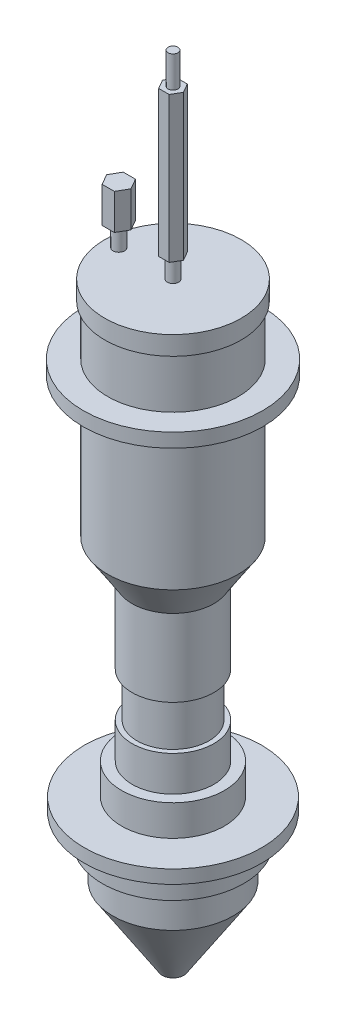
ISO-10303-21;
HEADER;
FILE_DESCRIPTION(('STEP AP214'),'2;1');
FILE_NAME('part.step','',(''),(''),'','','');
FILE_SCHEMA(('AUTOMOTIVE_DESIGN { 1 0 10303 214 1 1 1 1 }'));
ENDSEC;
DATA;
#1=APPLICATION_CONTEXT('core data for automotive mechanical design processes');
#2=APPLICATION_PROTOCOL_DEFINITION('international standard','automotive_design',2000,#1);
#3=PRODUCT_CONTEXT('',#1,'mechanical');
#4=PRODUCT('Part','Part','',(#3));
#5=PRODUCT_RELATED_PRODUCT_CATEGORY('part','',(#4));
#6=PRODUCT_DEFINITION_FORMATION('','',#4);
#7=PRODUCT_DEFINITION_CONTEXT('part definition',#1,'design');
#8=PRODUCT_DEFINITION('design','',#6,#7);
#9=PRODUCT_DEFINITION_SHAPE('','',#8);
#10=(LENGTH_UNIT() NAMED_UNIT(*) SI_UNIT(.MILLI.,.METRE.));
#11=(NAMED_UNIT(*) PLANE_ANGLE_UNIT() SI_UNIT($,.RADIAN.));
#12=(NAMED_UNIT(*) SI_UNIT($,.STERADIAN.) SOLID_ANGLE_UNIT());
#13=UNCERTAINTY_MEASURE_WITH_UNIT(LENGTH_MEASURE(1.E-05),#10,'distance_accuracy_value','');
#14=(GEOMETRIC_REPRESENTATION_CONTEXT(3) GLOBAL_UNCERTAINTY_ASSIGNED_CONTEXT((#13)) GLOBAL_UNIT_ASSIGNED_CONTEXT((#10,
#11,#12)) REPRESENTATION_CONTEXT('',''));
#15=CARTESIAN_POINT('',(0.,0.,0.));
#16=DIRECTION('',(0.,0.,1.));
#17=DIRECTION('',(1.,0.,0.));
#18=AXIS2_PLACEMENT_3D('',#15,#16,#17);
#19=CARTESIAN_POINT('',(0.,0.,0.));
#20=DIRECTION('',(0.,-1.,0.));
#21=DIRECTION('',(0.,0.,-1.));
#22=AXIS2_PLACEMENT_3D('',#19,#20,#21);
#23=PLANE('',#22);
#24=CARTESIAN_POINT('',(0.,0.,0.));
#25=DIRECTION('',(0.,-1.,0.));
#26=DIRECTION('',(0.,0.,-1.));
#27=AXIS2_PLACEMENT_3D('',#24,#25,#26);
#28=CIRCLE('',#27,7.5);
#29=CARTESIAN_POINT('',(0.,0.,7.5));
#30=VERTEX_POINT('',#29);
#31=EDGE_CURVE('E44',#30,#30,#28,.T.);
#32=ORIENTED_EDGE('',*,*,#31,.T.);
#33=EDGE_LOOP('',(#32));
#34=FACE_BOUND('',#33,.T.);
#35=ADVANCED_FACE('F41',(#34),#23,.T.);
#36=CARTESIAN_POINT('',(0.,0.,0.));
#37=DIRECTION('',(0.,1.,0.));
#38=DIRECTION('',(0.,0.,1.));
#39=AXIS2_PLACEMENT_3D('',#36,#37,#38);
#40=CONICAL_SURFACE('',#39,7.5,0.575221377485316);
#41=CARTESIAN_POINT('',(0.,53.35,0.));
#42=DIRECTION('',(0.,-1.,0.));
#43=DIRECTION('',(0.,0.,-1.));
#44=AXIS2_PLACEMENT_3D('',#41,#42,#43);
#45=CIRCLE('',#44,42.09);
#46=CARTESIAN_POINT('',(0.,53.35,42.09));
#47=VERTEX_POINT('',#46);
#48=EDGE_CURVE('E225',#47,#47,#45,.T.);
#49=CARTESIAN_POINT('',(0.,53.35,42.09));
#50=CARTESIAN_POINT('',(0.,52.7942708333333,41.7296875));
#51=CARTESIAN_POINT('',(0.,52.2385416666667,41.369375));
#52=CARTESIAN_POINT('',(0.,51.1270833333333,40.64875));
#53=CARTESIAN_POINT('',(0.,50.5713541666667,40.2884375));
#54=CARTESIAN_POINT('',(0.,49.4598958333333,39.5678125));
#55=CARTESIAN_POINT('',(0.,48.9041666666667,39.2075));
#56=CARTESIAN_POINT('',(0.,47.7927083333333,38.486875));
#57=CARTESIAN_POINT('',(0.,47.2369791666667,38.1265625));
#58=CARTESIAN_POINT('',(0.,46.1255208333333,37.4059375));
#59=CARTESIAN_POINT('',(0.,45.5697916666667,37.045625));
#60=CARTESIAN_POINT('',(0.,44.4583333333333,36.325));
#61=CARTESIAN_POINT('',(0.,43.9026041666667,35.9646875));
#62=CARTESIAN_POINT('',(0.,42.7911458333333,35.2440625));
#63=CARTESIAN_POINT('',(0.,42.2354166666667,34.88375));
#64=CARTESIAN_POINT('',(0.,41.1239583333333,34.163125));
#65=CARTESIAN_POINT('',(0.,40.5682291666667,33.8028125));
#66=CARTESIAN_POINT('',(0.,39.4567708333333,33.0821875));
#67=CARTESIAN_POINT('',(0.,38.9010416666667,32.721875));
#68=CARTESIAN_POINT('',(0.,37.7895833333333,32.00125));
#69=CARTESIAN_POINT('',(0.,37.2338541666667,31.6409375));
#70=CARTESIAN_POINT('',(0.,36.1223958333333,30.9203125));
#71=CARTESIAN_POINT('',(0.,35.5666666666667,30.56));
#72=CARTESIAN_POINT('',(0.,34.4552083333333,29.839375));
#73=CARTESIAN_POINT('',(0.,33.8994791666667,29.4790625));
#74=CARTESIAN_POINT('',(0.,32.7880208333333,28.7584375));
#75=CARTESIAN_POINT('',(0.,32.2322916666667,28.398125));
#76=CARTESIAN_POINT('',(0.,31.1208333333333,27.6775));
#77=CARTESIAN_POINT('',(0.,30.5651041666667,27.3171875));
#78=CARTESIAN_POINT('',(0.,29.4536458333333,26.5965625));
#79=CARTESIAN_POINT('',(0.,28.8979166666667,26.23625));
#80=CARTESIAN_POINT('',(0.,27.7864583333333,25.515625));
#81=CARTESIAN_POINT('',(0.,27.2307291666667,25.1553125));
#82=CARTESIAN_POINT('',(0.,26.1192708333333,24.4346875));
#83=CARTESIAN_POINT('',(0.,25.5635416666667,24.074375));
#84=CARTESIAN_POINT('',(0.,24.4520833333333,23.35375));
#85=CARTESIAN_POINT('',(0.,23.8963541666667,22.9934375));
#86=CARTESIAN_POINT('',(0.,22.7848958333333,22.2728125));
#87=CARTESIAN_POINT('',(0.,22.2291666666667,21.9125));
#88=CARTESIAN_POINT('',(0.,21.1177083333333,21.191875));
#89=CARTESIAN_POINT('',(0.,20.5619791666667,20.8315625));
#90=CARTESIAN_POINT('',(0.,19.4505208333333,20.1109375));
#91=CARTESIAN_POINT('',(0.,18.8947916666667,19.750625));
#92=CARTESIAN_POINT('',(0.,17.7833333333333,19.03));
#93=CARTESIAN_POINT('',(0.,17.2276041666667,18.6696875));
#94=CARTESIAN_POINT('',(0.,16.1161458333333,17.9490625));
#95=CARTESIAN_POINT('',(0.,15.5604166666667,17.58875));
#96=CARTESIAN_POINT('',(0.,14.4489583333333,16.868125));
#97=CARTESIAN_POINT('',(0.,13.8932291666667,16.5078125));
#98=CARTESIAN_POINT('',(0.,12.7817708333333,15.7871875));
#99=CARTESIAN_POINT('',(0.,12.2260416666667,15.426875));
#100=CARTESIAN_POINT('',(0.,11.1145833333333,14.70625));
#101=CARTESIAN_POINT('',(0.,10.5588541666667,14.3459375));
#102=CARTESIAN_POINT('',(0.,9.44739583333333,13.6253125));
#103=CARTESIAN_POINT('',(0.,8.89166666666667,13.265));
#104=CARTESIAN_POINT('',(0.,7.78020833333333,12.544375));
#105=CARTESIAN_POINT('',(0.,7.22447916666667,12.1840625));
#106=CARTESIAN_POINT('',(0.,6.11302083333333,11.4634375));
#107=CARTESIAN_POINT('',(0.,5.55729166666667,11.103125));
#108=CARTESIAN_POINT('',(0.,4.44583333333333,10.3825));
#109=CARTESIAN_POINT('',(0.,3.89010416666667,10.0221875));
#110=CARTESIAN_POINT('',(0.,2.77864583333333,9.3015625));
#111=CARTESIAN_POINT('',(0.,2.22291666666667,8.94125));
#112=CARTESIAN_POINT('',(0.,1.11145833333333,8.220625));
#113=CARTESIAN_POINT('',(0.,0.555729166666667,7.8603125));
#114=CARTESIAN_POINT('',(0.,0.,7.5));
#115=B_SPLINE_CURVE_WITH_KNOTS('',3,(#49,#50,#51,#52,#53,#54,#55,#56,#57,#58,#59,#60,#61,#62,
#63,#64,#65,#66,#67,#68,#69,#70,#71,#72,#73,#74,#75,#76,#77,#78,#79,#80,#81,#82,#83,#84,#85,#86,
#87,#88,#89,#90,#91,#92,#93,#94,#95,#96,#97,#98,#99,#100,#101,#102,#103,#104,#105,#106,#107,
#108,#109,#110,#111,#112,#113,#114),.UNSPECIFIED.,.F.,.F.,(4,2,2,2,2,2,2,2,2,2,2,2,2,2,2,2,2,2,
2,2,2,2,2,2,2,2,2,2,2,2,2,2,4),(0.,1.98694238443456,3.97388476886912,5.96082715330369,
7.94776953773825,9.93471192217281,11.9216543066074,13.9085966910419,15.8955390754765,
17.8824814599111,19.8694238443456,21.8563662287802,23.8433086132147,25.8302509976493,
27.8171933820839,29.8041357665184,31.791078150953,33.7780205353875,35.7649629198221,
37.7519053042567,39.7388476886912,41.7257900731258,43.7127324575604,45.6996748419949,
47.6866172264295,49.673559610864,51.6605019952986,53.6474443797332,55.6343867641677,
57.6213291486023,59.6082715330368,61.5952139174714,63.582156301906),.UNSPECIFIED.);
#116=EDGE_CURVE('BSEAM233',#47,#30,#115,.T.);
#117=ORIENTED_EDGE('',*,*,#48,.T.);
#118=ORIENTED_EDGE('',*,*,#31,.F.);
#119=ORIENTED_EDGE('',*,*,#116,.T.);
#120=ORIENTED_EDGE('',*,*,#116,.F.);
#121=EDGE_LOOP('',(#117,#119,#118,#120));
#122=FACE_BOUND('',#121,.T.);
#123=ADVANCED_FACE('F233',(#122),#40,.T.);
#124=CARTESIAN_POINT('',(0.,0.,0.));
#125=DIRECTION('',(0.,-1.,0.));
#126=DIRECTION('',(0.,0.,-1.));
#127=AXIS2_PLACEMENT_3D('',#124,#125,#126);
#128=CYLINDRICAL_SURFACE('',#127,42.09);
#129=CARTESIAN_POINT('',(0.,76.73,0.));
#130=DIRECTION('',(0.,-1.,0.));
#131=DIRECTION('',(0.,0.,-1.));
#132=AXIS2_PLACEMENT_3D('',#129,#130,#131);
#133=CIRCLE('',#132,42.09);
#134=CARTESIAN_POINT('',(0.,76.73,-42.09));
#135=VERTEX_POINT('',#134);
#136=EDGE_CURVE('E223',#135,#135,#133,.T.);
#137=ORIENTED_EDGE('',*,*,#136,.T.);
#138=EDGE_LOOP('',(#137));
#139=FACE_BOUND('',#138,.T.);
#140=ORIENTED_EDGE('',*,*,#48,.F.);
#141=EDGE_LOOP('',(#140));
#142=FACE_BOUND('',#141,.T.);
#143=ADVANCED_FACE('F235',(#139,#142),#128,.T.);
#144=CARTESIAN_POINT('',(42.09,76.73,0.));
#145=DIRECTION('',(0.,-1.,0.));
#146=DIRECTION('',(0.,0.,-1.));
#147=AXIS2_PLACEMENT_3D('',#144,#145,#146);
#148=PLANE('',#147);
#149=CARTESIAN_POINT('',(0.,76.73,0.));
#150=DIRECTION('',(0.,-1.,0.));
#151=DIRECTION('',(0.,0.,-1.));
#152=AXIS2_PLACEMENT_3D('',#149,#150,#151);
#153=CIRCLE('',#152,49.525);
#154=CARTESIAN_POINT('',(0.,76.73,-49.525));
#155=VERTEX_POINT('',#154);
#156=EDGE_CURVE('E220',#155,#155,#153,.T.);
#157=ORIENTED_EDGE('',*,*,#156,.T.);
#158=EDGE_LOOP('',(#157));
#159=FACE_BOUND('',#158,.T.);
#160=ORIENTED_EDGE('',*,*,#136,.F.);
#161=EDGE_LOOP('',(#160));
#162=FACE_BOUND('',#161,.T.);
#163=ADVANCED_FACE('F240',(#159,#162),#148,.T.);
#164=CARTESIAN_POINT('',(0.,0.,0.));
#165=DIRECTION('',(0.,-1.,0.));
#166=DIRECTION('',(0.,0.,-1.));
#167=AXIS2_PLACEMENT_3D('',#164,#165,#166);
#168=CYLINDRICAL_SURFACE('',#167,49.525);
#169=CARTESIAN_POINT('',(0.,95.5,0.));
#170=DIRECTION('',(0.,-1.,0.));
#171=DIRECTION('',(0.,0.,-1.));
#172=AXIS2_PLACEMENT_3D('',#169,#170,#171);
#173=CIRCLE('',#172,49.525);
#174=CARTESIAN_POINT('',(0.,95.5,-49.525));
#175=VERTEX_POINT('',#174);
#176=EDGE_CURVE('E217',#175,#175,#173,.T.);
#177=ORIENTED_EDGE('',*,*,#176,.T.);
#178=EDGE_LOOP('',(#177));
#179=FACE_BOUND('',#178,.T.);
#180=ORIENTED_EDGE('',*,*,#156,.F.);
#181=EDGE_LOOP('',(#180));
#182=FACE_BOUND('',#181,.T.);
#183=ADVANCED_FACE('F247',(#179,#182),#168,.T.);
#184=CARTESIAN_POINT('',(49.525,95.5,0.));
#185=DIRECTION('',(0.,-1.,0.));
#186=DIRECTION('',(0.,0.,-1.));
#187=AXIS2_PLACEMENT_3D('',#184,#185,#186);
#188=PLANE('',#187);
#189=CARTESIAN_POINT('',(0.,95.5,0.));
#190=DIRECTION('',(0.,-1.,0.));
#191=DIRECTION('',(0.,0.,-1.));
#192=AXIS2_PLACEMENT_3D('',#189,#190,#191);
#193=CIRCLE('',#192,62.215);
#194=CARTESIAN_POINT('',(0.,95.5,-62.215));
#195=VERTEX_POINT('',#194);
#196=EDGE_CURVE('E214',#195,#195,#193,.T.);
#197=ORIENTED_EDGE('',*,*,#196,.T.);
#198=EDGE_LOOP('',(#197));
#199=FACE_BOUND('',#198,.T.);
#200=ORIENTED_EDGE('',*,*,#176,.F.);
#201=EDGE_LOOP('',(#200));
#202=FACE_BOUND('',#201,.T.);
#203=ADVANCED_FACE('F250',(#199,#202),#188,.T.);
#204=CARTESIAN_POINT('',(0.,0.,0.));
#205=DIRECTION('',(0.,-1.,0.));
#206=DIRECTION('',(0.,0.,-1.));
#207=AXIS2_PLACEMENT_3D('',#204,#205,#206);
#208=CYLINDRICAL_SURFACE('',#207,62.215);
#209=CARTESIAN_POINT('',(0.,104.91,0.));
#210=DIRECTION('',(0.,-1.,0.));
#211=DIRECTION('',(0.,0.,-1.));
#212=AXIS2_PLACEMENT_3D('',#209,#210,#211);
#213=CIRCLE('',#212,62.215);
#214=CARTESIAN_POINT('',(0.,104.91,-62.215));
#215=VERTEX_POINT('',#214);
#216=EDGE_CURVE('E211',#215,#215,#213,.T.);
#217=ORIENTED_EDGE('',*,*,#216,.T.);
#218=EDGE_LOOP('',(#217));
#219=FACE_BOUND('',#218,.T.);
#220=ORIENTED_EDGE('',*,*,#196,.F.);
#221=EDGE_LOOP('',(#220));
#222=FACE_BOUND('',#221,.T.);
#223=ADVANCED_FACE('F254',(#219,#222),#208,.T.);
#224=CARTESIAN_POINT('',(62.215,104.91,0.));
#225=DIRECTION('',(0.,1.,0.));
#226=DIRECTION('',(0.,0.,1.));
#227=AXIS2_PLACEMENT_3D('',#224,#225,#226);
#228=PLANE('',#227);
#229=CARTESIAN_POINT('',(0.,104.91,0.));
#230=DIRECTION('',(0.,-1.,0.));
#231=DIRECTION('',(0.,0.,-1.));
#232=AXIS2_PLACEMENT_3D('',#229,#230,#231);
#233=CIRCLE('',#232,36.02);
#234=CARTESIAN_POINT('',(0.,104.91,-36.02));
#235=VERTEX_POINT('',#234);
#236=EDGE_CURVE('E208',#235,#235,#233,.T.);
#237=ORIENTED_EDGE('',*,*,#236,.T.);
#238=EDGE_LOOP('',(#237));
#239=FACE_BOUND('',#238,.T.);
#240=ORIENTED_EDGE('',*,*,#216,.F.);
#241=EDGE_LOOP('',(#240));
#242=FACE_BOUND('',#241,.T.);
#243=ADVANCED_FACE('F258',(#239,#242),#228,.T.);
#244=CARTESIAN_POINT('',(0.,0.,0.));
#245=DIRECTION('',(0.,-1.,0.));
#246=DIRECTION('',(0.,0.,-1.));
#247=AXIS2_PLACEMENT_3D('',#244,#245,#246);
#248=CYLINDRICAL_SURFACE('',#247,36.02);
#249=CARTESIAN_POINT('',(0.,126.55,0.));
#250=DIRECTION('',(0.,-1.,0.));
#251=DIRECTION('',(0.,0.,-1.));
#252=AXIS2_PLACEMENT_3D('',#249,#250,#251);
#253=CIRCLE('',#252,36.02);
#254=CARTESIAN_POINT('',(0.,126.55,-36.02));
#255=VERTEX_POINT('',#254);
#256=EDGE_CURVE('E205',#255,#255,#253,.T.);
#257=ORIENTED_EDGE('',*,*,#256,.T.);
#258=EDGE_LOOP('',(#257));
#259=FACE_BOUND('',#258,.T.);
#260=ORIENTED_EDGE('',*,*,#236,.F.);
#261=EDGE_LOOP('',(#260));
#262=FACE_BOUND('',#261,.T.);
#263=ADVANCED_FACE('F262',(#259,#262),#248,.T.);
#264=CARTESIAN_POINT('',(36.02,126.55,0.));
#265=DIRECTION('',(0.,1.,0.));
#266=DIRECTION('',(0.,0.,1.));
#267=AXIS2_PLACEMENT_3D('',#264,#265,#266);
#268=PLANE('',#267);
#269=CARTESIAN_POINT('',(0.,126.55,0.));
#270=DIRECTION('',(0.,-1.,0.));
#271=DIRECTION('',(0.,0.,-1.));
#272=AXIS2_PLACEMENT_3D('',#269,#270,#271);
#273=CIRCLE('',#272,28.645);
#274=CARTESIAN_POINT('',(0.,126.55,-28.645));
#275=VERTEX_POINT('',#274);
#276=EDGE_CURVE('E202',#275,#275,#273,.T.);
#277=ORIENTED_EDGE('',*,*,#276,.T.);
#278=EDGE_LOOP('',(#277));
#279=FACE_BOUND('',#278,.T.);
#280=ORIENTED_EDGE('',*,*,#256,.F.);
#281=EDGE_LOOP('',(#280));
#282=FACE_BOUND('',#281,.T.);
#283=ADVANCED_FACE('F266',(#279,#282),#268,.T.);
#284=CARTESIAN_POINT('',(0.,0.,0.));
#285=DIRECTION('',(0.,-1.,0.));
#286=DIRECTION('',(0.,0.,-1.));
#287=AXIS2_PLACEMENT_3D('',#284,#285,#286);
#288=CYLINDRICAL_SURFACE('',#287,28.645);
#289=CARTESIAN_POINT('',(0.,151.31,0.));
#290=DIRECTION('',(0.,-1.,0.));
#291=DIRECTION('',(0.,0.,-1.));
#292=AXIS2_PLACEMENT_3D('',#289,#290,#291);
#293=CIRCLE('',#292,28.645);
#294=CARTESIAN_POINT('',(0.,151.31,-28.645));
#295=VERTEX_POINT('',#294);
#296=EDGE_CURVE('E199',#295,#295,#293,.T.);
#297=ORIENTED_EDGE('',*,*,#296,.T.);
#298=EDGE_LOOP('',(#297));
#299=FACE_BOUND('',#298,.T.);
#300=ORIENTED_EDGE('',*,*,#276,.F.);
#301=EDGE_LOOP('',(#300));
#302=FACE_BOUND('',#301,.T.);
#303=ADVANCED_FACE('F270',(#299,#302),#288,.T.);
#304=CARTESIAN_POINT('',(28.645,151.31,0.));
#305=DIRECTION('',(0.,1.,0.));
#306=DIRECTION('',(0.,0.,1.));
#307=AXIS2_PLACEMENT_3D('',#304,#305,#306);
#308=PLANE('',#307);
#309=CARTESIAN_POINT('',(0.,151.31,0.));
#310=DIRECTION('',(0.,-1.,0.));
#311=DIRECTION('',(0.,0.,-1.));
#312=AXIS2_PLACEMENT_3D('',#309,#310,#311);
#313=CIRCLE('',#312,25.25);
#314=CARTESIAN_POINT('',(0.,151.31,-25.25));
#315=VERTEX_POINT('',#314);
#316=EDGE_CURVE('E196',#315,#315,#313,.T.);
#317=ORIENTED_EDGE('',*,*,#316,.T.);
#318=EDGE_LOOP('',(#317));
#319=FACE_BOUND('',#318,.T.);
#320=ORIENTED_EDGE('',*,*,#296,.F.);
#321=EDGE_LOOP('',(#320));
#322=FACE_BOUND('',#321,.T.);
#323=ADVANCED_FACE('F274',(#319,#322),#308,.T.);
#324=CARTESIAN_POINT('',(0.,0.,0.));
#325=DIRECTION('',(0.,-1.,0.));
#326=DIRECTION('',(0.,0.,-1.));
#327=AXIS2_PLACEMENT_3D('',#324,#325,#326);
#328=CYLINDRICAL_SURFACE('',#327,25.25);
#329=CARTESIAN_POINT('',(0.,182.28,0.));
#330=DIRECTION('',(0.,-1.,0.));
#331=DIRECTION('',(0.,0.,-1.));
#332=AXIS2_PLACEMENT_3D('',#329,#330,#331);
#333=CIRCLE('',#332,25.25);
#334=CARTESIAN_POINT('',(0.,182.28,-25.25));
#335=VERTEX_POINT('',#334);
#336=EDGE_CURVE('E193',#335,#335,#333,.T.);
#337=ORIENTED_EDGE('',*,*,#336,.T.);
#338=EDGE_LOOP('',(#337));
#339=FACE_BOUND('',#338,.T.);
#340=ORIENTED_EDGE('',*,*,#316,.F.);
#341=EDGE_LOOP('',(#340));
#342=FACE_BOUND('',#341,.T.);
#343=ADVANCED_FACE('F278',(#339,#342),#328,.T.);
#344=CARTESIAN_POINT('',(25.25,182.28,0.));
#345=DIRECTION('',(0.,-1.,0.));
#346=DIRECTION('',(0.,0.,-1.));
#347=AXIS2_PLACEMENT_3D('',#344,#345,#346);
#348=PLANE('',#347);
#349=CARTESIAN_POINT('',(0.,182.28,0.));
#350=DIRECTION('',(0.,-1.,0.));
#351=DIRECTION('',(0.,0.,-1.));
#352=AXIS2_PLACEMENT_3D('',#349,#350,#351);
#353=CIRCLE('',#352,28.645);
#354=CARTESIAN_POINT('',(0.,182.28,-28.645));
#355=VERTEX_POINT('',#354);
#356=EDGE_CURVE('E190',#355,#355,#353,.T.);
#357=ORIENTED_EDGE('',*,*,#356,.T.);
#358=EDGE_LOOP('',(#357));
#359=FACE_BOUND('',#358,.T.);
#360=ORIENTED_EDGE('',*,*,#336,.F.);
#361=EDGE_LOOP('',(#360));
#362=FACE_BOUND('',#361,.T.);
#363=ADVANCED_FACE('F282',(#359,#362),#348,.T.);
#364=CARTESIAN_POINT('',(0.,0.,0.));
#365=DIRECTION('',(0.,-1.,0.));
#366=DIRECTION('',(0.,0.,-1.));
#367=AXIS2_PLACEMENT_3D('',#364,#365,#366);
#368=CYLINDRICAL_SURFACE('',#367,28.645);
#369=CARTESIAN_POINT('',(0.,236.27,0.));
#370=DIRECTION('',(0.,-1.,0.));
#371=DIRECTION('',(0.,0.,-1.));
#372=AXIS2_PLACEMENT_3D('',#369,#370,#371);
#373=CIRCLE('',#372,28.645);
#374=CARTESIAN_POINT('',(0.,236.27,-28.645));
#375=VERTEX_POINT('',#374);
#376=EDGE_CURVE('E187',#375,#375,#373,.T.);
#377=ORIENTED_EDGE('',*,*,#376,.T.);
#378=EDGE_LOOP('',(#377));
#379=FACE_BOUND('',#378,.T.);
#380=ORIENTED_EDGE('',*,*,#356,.F.);
#381=EDGE_LOOP('',(#380));
#382=FACE_BOUND('',#381,.T.);
#383=ADVANCED_FACE('F286',(#379,#382),#368,.T.);
#384=CARTESIAN_POINT('',(0.,236.27,0.));
#385=DIRECTION('',(0.,1.,0.));
#386=DIRECTION('',(0.,0.,1.));
#387=AXIS2_PLACEMENT_3D('',#384,#385,#386);
#388=CONICAL_SURFACE('',#387,28.645,0.575309350178365);
#389=CARTESIAN_POINT('',(0.,262.67,0.));
#390=DIRECTION('',(0.,-1.,0.));
#391=DIRECTION('',(0.,0.,-1.));
#392=AXIS2_PLACEMENT_3D('',#389,#390,#391);
#393=CIRCLE('',#392,45.765);
#394=CARTESIAN_POINT('',(0.,262.67,-45.765));
#395=VERTEX_POINT('',#394);
#396=EDGE_CURVE('E184',#395,#395,#393,.T.);
#397=ORIENTED_EDGE('',*,*,#396,.T.);
#398=EDGE_LOOP('',(#397));
#399=FACE_BOUND('',#398,.T.);
#400=ORIENTED_EDGE('',*,*,#376,.F.);
#401=EDGE_LOOP('',(#400));
#402=FACE_BOUND('',#401,.T.);
#403=ADVANCED_FACE('F290',(#399,#402),#388,.T.);
#404=CARTESIAN_POINT('',(0.,0.,0.));
#405=DIRECTION('',(0.,-1.,0.));
#406=DIRECTION('',(0.,0.,-1.));
#407=AXIS2_PLACEMENT_3D('',#404,#405,#406);
#408=CYLINDRICAL_SURFACE('',#407,45.765);
#409=CARTESIAN_POINT('',(0.,360.73,0.));
#410=DIRECTION('',(0.,-1.,0.));
#411=DIRECTION('',(0.,0.,-1.));
#412=AXIS2_PLACEMENT_3D('',#409,#410,#411);
#413=CIRCLE('',#412,45.765);
#414=CARTESIAN_POINT('',(0.,360.73,-45.765));
#415=VERTEX_POINT('',#414);
#416=EDGE_CURVE('E181',#415,#415,#413,.T.);
#417=ORIENTED_EDGE('',*,*,#416,.T.);
#418=EDGE_LOOP('',(#417));
#419=FACE_BOUND('',#418,.T.);
#420=ORIENTED_EDGE('',*,*,#396,.F.);
#421=EDGE_LOOP('',(#420));
#422=FACE_BOUND('',#421,.T.);
#423=ADVANCED_FACE('F294',(#419,#422),#408,.T.);
#424=CARTESIAN_POINT('',(45.765,360.73,0.));
#425=DIRECTION('',(0.,-1.,0.));
#426=DIRECTION('',(0.,0.,-1.));
#427=AXIS2_PLACEMENT_3D('',#424,#425,#426);
#428=PLANE('',#427);
#429=CARTESIAN_POINT('',(0.,360.73,0.));
#430=DIRECTION('',(0.,-1.,0.));
#431=DIRECTION('',(0.,0.,-1.));
#432=AXIS2_PLACEMENT_3D('',#429,#430,#431);
#433=CIRCLE('',#432,62.835);
#434=CARTESIAN_POINT('',(0.,360.73,-62.835));
#435=VERTEX_POINT('',#434);
#436=EDGE_CURVE('E178',#435,#435,#433,.T.);
#437=ORIENTED_EDGE('',*,*,#436,.T.);
#438=EDGE_LOOP('',(#437));
#439=FACE_BOUND('',#438,.T.);
#440=ORIENTED_EDGE('',*,*,#416,.F.);
#441=EDGE_LOOP('',(#440));
#442=FACE_BOUND('',#441,.T.);
#443=ADVANCED_FACE('F298',(#439,#442),#428,.T.);
#444=CARTESIAN_POINT('',(0.,0.,0.));
#445=DIRECTION('',(0.,-1.,0.));
#446=DIRECTION('',(0.,0.,-1.));
#447=AXIS2_PLACEMENT_3D('',#444,#445,#446);
#448=CYLINDRICAL_SURFACE('',#447,62.835);
#449=CARTESIAN_POINT('',(0.,370.54,0.));
#450=DIRECTION('',(0.,-1.,0.));
#451=DIRECTION('',(0.,0.,-1.));
#452=AXIS2_PLACEMENT_3D('',#449,#450,#451);
#453=CIRCLE('',#452,62.835);
#454=CARTESIAN_POINT('',(0.,370.54,-62.835));
#455=VERTEX_POINT('',#454);
#456=EDGE_CURVE('E175',#455,#455,#453,.T.);
#457=ORIENTED_EDGE('',*,*,#456,.T.);
#458=EDGE_LOOP('',(#457));
#459=FACE_BOUND('',#458,.T.);
#460=ORIENTED_EDGE('',*,*,#436,.F.);
#461=EDGE_LOOP('',(#460));
#462=FACE_BOUND('',#461,.T.);
#463=ADVANCED_FACE('F302',(#459,#462),#448,.T.);
#464=CARTESIAN_POINT('',(62.835,370.54,0.));
#465=DIRECTION('',(0.,1.,0.));
#466=DIRECTION('',(0.,0.,1.));
#467=AXIS2_PLACEMENT_3D('',#464,#465,#466);
#468=PLANE('',#467);
#469=CARTESIAN_POINT('',(0.,370.54,0.));
#470=DIRECTION('',(0.,-1.,0.));
#471=DIRECTION('',(0.,0.,-1.));
#472=AXIS2_PLACEMENT_3D('',#469,#470,#471);
#473=CIRCLE('',#472,45.765);
#474=CARTESIAN_POINT('',(0.,370.54,-45.765));
#475=VERTEX_POINT('',#474);
#476=EDGE_CURVE('E172',#475,#475,#473,.T.);
#477=ORIENTED_EDGE('',*,*,#476,.T.);
#478=EDGE_LOOP('',(#477));
#479=FACE_BOUND('',#478,.T.);
#480=ORIENTED_EDGE('',*,*,#456,.F.);
#481=EDGE_LOOP('',(#480));
#482=FACE_BOUND('',#481,.T.);
#483=ADVANCED_FACE('F306',(#479,#482),#468,.T.);
#484=CARTESIAN_POINT('',(0.,0.,0.));
#485=DIRECTION('',(0.,-1.,0.));
#486=DIRECTION('',(0.,0.,-1.));
#487=AXIS2_PLACEMENT_3D('',#484,#485,#486);
#488=CYLINDRICAL_SURFACE('',#487,45.765);
#489=CARTESIAN_POINT('',(0.,405.93,0.));
#490=DIRECTION('',(0.,-1.,0.));
#491=DIRECTION('',(0.,0.,-1.));
#492=AXIS2_PLACEMENT_3D('',#489,#490,#491);
#493=CIRCLE('',#492,45.765);
#494=CARTESIAN_POINT('',(0.,405.93,-45.765));
#495=VERTEX_POINT('',#494);
#496=EDGE_CURVE('E169',#495,#495,#493,.T.);
#497=ORIENTED_EDGE('',*,*,#496,.T.);
#498=EDGE_LOOP('',(#497));
#499=FACE_BOUND('',#498,.T.);
#500=ORIENTED_EDGE('',*,*,#476,.F.);
#501=EDGE_LOOP('',(#500));
#502=FACE_BOUND('',#501,.T.);
#503=ADVANCED_FACE('F310',(#499,#502),#488,.T.);
#504=CARTESIAN_POINT('',(45.765,405.93,0.));
#505=DIRECTION('',(0.,-1.,0.));
#506=DIRECTION('',(0.,0.,-1.));
#507=AXIS2_PLACEMENT_3D('',#504,#505,#506);
#508=PLANE('',#507);
#509=CARTESIAN_POINT('',(0.,405.93,0.));
#510=DIRECTION('',(0.,-1.,0.));
#511=DIRECTION('',(0.,0.,-1.));
#512=AXIS2_PLACEMENT_3D('',#509,#510,#511);
#513=CIRCLE('',#512,47.82);
#514=CARTESIAN_POINT('',(0.,405.93,-47.82));
#515=VERTEX_POINT('',#514);
#516=EDGE_CURVE('E166',#515,#515,#513,.T.);
#517=ORIENTED_EDGE('',*,*,#516,.T.);
#518=EDGE_LOOP('',(#517));
#519=FACE_BOUND('',#518,.T.);
#520=ORIENTED_EDGE('',*,*,#496,.F.);
#521=EDGE_LOOP('',(#520));
#522=FACE_BOUND('',#521,.T.);
#523=ADVANCED_FACE('F314',(#519,#522),#508,.T.);
#524=CARTESIAN_POINT('',(0.,0.,0.));
#525=DIRECTION('',(0.,-1.,0.));
#526=DIRECTION('',(0.,0.,-1.));
#527=AXIS2_PLACEMENT_3D('',#524,#525,#526);
#528=CYLINDRICAL_SURFACE('',#527,47.82);
#529=CARTESIAN_POINT('',(0.,419.14,0.));
#530=DIRECTION('',(0.,-1.,0.));
#531=DIRECTION('',(0.,0.,-1.));
#532=AXIS2_PLACEMENT_3D('',#529,#530,#531);
#533=CIRCLE('',#532,47.82);
#534=CARTESIAN_POINT('',(0.,419.14,-47.82));
#535=VERTEX_POINT('',#534);
#536=EDGE_CURVE('E161',#535,#535,#533,.T.);
#537=ORIENTED_EDGE('',*,*,#536,.T.);
#538=EDGE_LOOP('',(#537));
#539=FACE_BOUND('',#538,.T.);
#540=ORIENTED_EDGE('',*,*,#516,.F.);
#541=EDGE_LOOP('',(#540));
#542=FACE_BOUND('',#541,.T.);
#543=ADVANCED_FACE('F318',(#539,#542),#528,.T.);
#544=CARTESIAN_POINT('',(47.82,419.14,0.));
#545=DIRECTION('',(0.,1.,0.));
#546=DIRECTION('',(0.,0.,1.));
#547=AXIS2_PLACEMENT_3D('',#544,#545,#546);
#548=PLANE('',#547);
#549=CARTESIAN_POINT('',(-38.,419.14,0.));
#550=DIRECTION('',(0.,1.,0.));
#551=DIRECTION('',(0.,0.,1.));
#552=AXIS2_PLACEMENT_3D('',#549,#550,#551);
#553=CIRCLE('',#552,4.);
#554=CARTESIAN_POINT('',(-38.,419.14,4.));
#555=VERTEX_POINT('',#554);
#556=EDGE_CURVE('E151',#555,#555,#553,.T.);
#557=ORIENTED_EDGE('',*,*,#556,.F.);
#558=EDGE_LOOP('',(#557));
#559=FACE_BOUND('',#558,.T.);
#560=CARTESIAN_POINT('',(0.,419.14,0.));
#561=DIRECTION('',(0.,1.,0.));
#562=DIRECTION('',(0.,0.,1.));
#563=AXIS2_PLACEMENT_3D('',#560,#561,#562);
#564=CIRCLE('',#563,4.);
#565=CARTESIAN_POINT('',(0.,419.14,4.));
#566=VERTEX_POINT('',#565);
#567=EDGE_CURVE('E155',#566,#566,#564,.T.);
#568=ORIENTED_EDGE('',*,*,#567,.F.);
#569=EDGE_LOOP('',(#568));
#570=FACE_BOUND('',#569,.T.);
#571=ORIENTED_EDGE('',*,*,#536,.F.);
#572=EDGE_LOOP('',(#571));
#573=FACE_BOUND('',#572,.T.);
#574=ADVANCED_FACE('F322',(#559,#570,#573),#548,.T.);
#575=CARTESIAN_POINT('',(0.,434.14,0.));
#576=DIRECTION('',(0.,-1.,0.));
#577=DIRECTION('',(0.,0.,-1.));
#578=AXIS2_PLACEMENT_3D('',#575,#576,#577);
#579=CYLINDRICAL_SURFACE('',#578,4.);
#580=CARTESIAN_POINT('',(0.,434.14,0.));
#581=DIRECTION('',(0.,1.,0.));
#582=DIRECTION('',(0.,0.,1.));
#583=AXIS2_PLACEMENT_3D('',#580,#581,#582);
#584=CIRCLE('',#583,4.);
#585=CARTESIAN_POINT('',(0.,434.14,4.));
#586=VERTEX_POINT('',#585);
#587=EDGE_CURVE('E158',#586,#586,#584,.T.);
#588=ORIENTED_EDGE('',*,*,#587,.F.);
#589=EDGE_LOOP('',(#588));
#590=FACE_BOUND('',#589,.T.);
#591=ORIENTED_EDGE('',*,*,#567,.T.);
#592=EDGE_LOOP('',(#591));
#593=FACE_BOUND('',#592,.T.);
#594=ADVANCED_FACE('F326',(#590,#593),#579,.T.);
#595=CARTESIAN_POINT('',(-38.,434.14,0.));
#596=DIRECTION('',(0.,-1.,0.));
#597=DIRECTION('',(0.,0.,-1.));
#598=AXIS2_PLACEMENT_3D('',#595,#596,#597);
#599=CYLINDRICAL_SURFACE('',#598,4.);
#600=CARTESIAN_POINT('',(-38.,434.14,0.));
#601=DIRECTION('',(0.,1.,0.));
#602=DIRECTION('',(0.,0.,1.));
#603=AXIS2_PLACEMENT_3D('',#600,#601,#602);
#604=CIRCLE('',#603,4.);
#605=CARTESIAN_POINT('',(-38.,434.14,4.));
#606=VERTEX_POINT('',#605);
#607=EDGE_CURVE('E152',#606,#606,#604,.T.);
#608=ORIENTED_EDGE('',*,*,#607,.F.);
#609=EDGE_LOOP('',(#608));
#610=FACE_BOUND('',#609,.T.);
#611=ORIENTED_EDGE('',*,*,#556,.T.);
#612=EDGE_LOOP('',(#611));
#613=FACE_BOUND('',#612,.T.);
#614=ADVANCED_FACE('F330',(#610,#613),#599,.T.);
#615=CARTESIAN_POINT('',(-3.67483446339197,536.14,6.365));
#616=DIRECTION('',(0.,0.,-1.));
#617=DIRECTION('',(-1.,0.,0.));
#618=AXIS2_PLACEMENT_3D('',#615,#616,#617);
#619=PLANE('',#618);
#620=DIRECTION('',(1.,0.,0.));
#621=VECTOR('',#620,1.);
#622=CARTESIAN_POINT('',(-3.67483446339197,434.14,6.365));
#623=LINE('',#622,#621);
#624=CARTESIAN_POINT('',(-3.67483446339197,434.14,6.365));
#625=VERTEX_POINT('',#624);
#626=CARTESIAN_POINT('',(3.67483446339197,434.14,6.365));
#627=VERTEX_POINT('',#626);
#628=EDGE_CURVE('E131',#625,#627,#623,.T.);
#629=ORIENTED_EDGE('',*,*,#628,.T.);
#630=DIRECTION('',(0.,-1.,0.));
#631=VECTOR('',#630,1.);
#632=CARTESIAN_POINT('',(3.67483446339197,536.14,6.365));
#633=LINE('',#632,#631);
#634=CARTESIAN_POINT('',(3.67483446339197,536.14,6.365));
#635=VERTEX_POINT('',#634);
#636=EDGE_CURVE('E149',#635,#627,#633,.T.);
#637=ORIENTED_EDGE('',*,*,#636,.F.);
#638=DIRECTION('',(1.,0.,0.));
#639=VECTOR('',#638,1.);
#640=CARTESIAN_POINT('',(-3.67483446339197,536.14,6.365));
#641=LINE('',#640,#639);
#642=CARTESIAN_POINT('',(-3.67483446339197,536.14,6.365));
#643=VERTEX_POINT('',#642);
#644=EDGE_CURVE('E142',#643,#635,#641,.T.);
#645=ORIENTED_EDGE('',*,*,#644,.F.);
#646=DIRECTION('',(0.,-1.,0.));
#647=VECTOR('',#646,1.);
#648=CARTESIAN_POINT('',(-3.67483446339197,536.14,6.365));
#649=LINE('',#648,#647);
#650=EDGE_CURVE('E127',#643,#625,#649,.T.);
#651=ORIENTED_EDGE('',*,*,#650,.T.);
#652=EDGE_LOOP('',(#629,#637,#645,#651));
#653=FACE_BOUND('',#652,.T.);
#654=ADVANCED_FACE('F334',(#653),#619,.F.);
#655=CARTESIAN_POINT('',(3.67483446339197,536.14,6.365));
#656=DIRECTION('',(-0.866025403784439,0.,-0.5));
#657=DIRECTION('',(-0.5,0.,0.866025403784439));
#658=AXIS2_PLACEMENT_3D('',#655,#656,#657);
#659=PLANE('',#658);
#660=DIRECTION('',(0.5,0.,-0.866025403784439));
#661=VECTOR('',#660,1.);
#662=CARTESIAN_POINT('',(3.67483446339197,434.14,6.365));
#663=LINE('',#662,#661);
#664=CARTESIAN_POINT('',(7.34966892678393,434.14,0.));
#665=VERTEX_POINT('',#664);
#666=EDGE_CURVE('E134',#627,#665,#663,.T.);
#667=ORIENTED_EDGE('',*,*,#666,.T.);
#668=DIRECTION('',(0.,-1.,0.));
#669=VECTOR('',#668,1.);
#670=CARTESIAN_POINT('',(7.34966892678393,536.14,0.));
#671=LINE('',#670,#669);
#672=CARTESIAN_POINT('',(7.34966892678393,536.14,0.));
#673=VERTEX_POINT('',#672);
#674=EDGE_CURVE('E146',#673,#665,#671,.T.);
#675=ORIENTED_EDGE('',*,*,#674,.F.);
#676=DIRECTION('',(0.5,0.,-0.866025403784439));
#677=VECTOR('',#676,1.);
#678=CARTESIAN_POINT('',(3.67483446339197,536.14,6.365));
#679=LINE('',#678,#677);
#680=EDGE_CURVE('E97',#635,#673,#679,.T.);
#681=ORIENTED_EDGE('',*,*,#680,.F.);
#682=ORIENTED_EDGE('',*,*,#636,.T.);
#683=EDGE_LOOP('',(#667,#675,#681,#682));
#684=FACE_BOUND('',#683,.T.);
#685=ADVANCED_FACE('F338',(#684),#659,.F.);
#686=CARTESIAN_POINT('',(7.34966892678393,536.14,0.));
#687=DIRECTION('',(-0.866025403784439,0.,0.5));
#688=DIRECTION('',(0.5,0.,0.866025403784438));
#689=AXIS2_PLACEMENT_3D('',#686,#687,#688);
#690=PLANE('',#689);
#691=DIRECTION('',(-0.5,0.,-0.866025403784439));
#692=VECTOR('',#691,1.);
#693=CARTESIAN_POINT('',(7.34966892678393,434.14,0.));
#694=LINE('',#693,#692);
#695=CARTESIAN_POINT('',(3.67483446339196,434.14,-6.365));
#696=VERTEX_POINT('',#695);
#697=EDGE_CURVE('E137',#665,#696,#694,.T.);
#698=ORIENTED_EDGE('',*,*,#697,.T.);
#699=DIRECTION('',(0.,-1.,0.));
#700=VECTOR('',#699,1.);
#701=CARTESIAN_POINT('',(3.67483446339196,536.14,-6.365));
#702=LINE('',#701,#700);
#703=CARTESIAN_POINT('',(3.67483446339196,536.14,-6.365));
#704=VERTEX_POINT('',#703);
#705=EDGE_CURVE('E122',#704,#696,#702,.T.);
#706=ORIENTED_EDGE('',*,*,#705,.F.);
#707=DIRECTION('',(-0.5,0.,-0.866025403784439));
#708=VECTOR('',#707,1.);
#709=CARTESIAN_POINT('',(7.34966892678393,536.14,0.));
#710=LINE('',#709,#708);
#711=EDGE_CURVE('E113',#673,#704,#710,.T.);
#712=ORIENTED_EDGE('',*,*,#711,.F.);
#713=ORIENTED_EDGE('',*,*,#674,.T.);
#714=EDGE_LOOP('',(#698,#706,#712,#713));
#715=FACE_BOUND('',#714,.T.);
#716=ADVANCED_FACE('F342',(#715),#690,.F.);
#717=CARTESIAN_POINT('',(3.67483446339196,536.14,-6.365));
#718=DIRECTION('',(0.,0.,1.));
#719=DIRECTION('',(1.,0.,0.));
#720=AXIS2_PLACEMENT_3D('',#717,#718,#719);
#721=PLANE('',#720);
#722=DIRECTION('',(-1.,0.,0.));
#723=VECTOR('',#722,1.);
#724=CARTESIAN_POINT('',(3.67483446339196,434.14,-6.365));
#725=LINE('',#724,#723);
#726=CARTESIAN_POINT('',(-3.67483446339197,434.14,-6.365));
#727=VERTEX_POINT('',#726);
#728=EDGE_CURVE('E121',#696,#727,#725,.T.);
#729=ORIENTED_EDGE('',*,*,#728,.T.);
#730=DIRECTION('',(0.,-1.,0.));
#731=VECTOR('',#730,1.);
#732=CARTESIAN_POINT('',(-3.67483446339197,536.14,-6.365));
#733=LINE('',#732,#731);
#734=CARTESIAN_POINT('',(-3.67483446339197,536.14,-6.365));
#735=VERTEX_POINT('',#734);
#736=EDGE_CURVE('E118',#735,#727,#733,.T.);
#737=ORIENTED_EDGE('',*,*,#736,.F.);
#738=DIRECTION('',(-1.,0.,0.));
#739=VECTOR('',#738,1.);
#740=CARTESIAN_POINT('',(3.67483446339196,536.14,-6.365));
#741=LINE('',#740,#739);
#742=EDGE_CURVE('E107',#704,#735,#741,.T.);
#743=ORIENTED_EDGE('',*,*,#742,.F.);
#744=ORIENTED_EDGE('',*,*,#705,.T.);
#745=EDGE_LOOP('',(#729,#737,#743,#744));
#746=FACE_BOUND('',#745,.T.);
#747=ADVANCED_FACE('F119',(#746),#721,.F.);
#748=CARTESIAN_POINT('',(-3.67483446339197,536.14,-6.365));
#749=DIRECTION('',(0.866025403784439,0.,0.5));
#750=DIRECTION('',(0.5,0.,-0.866025403784439));
#751=AXIS2_PLACEMENT_3D('',#748,#749,#750);
#752=PLANE('',#751);
#753=DIRECTION('',(-0.5,0.,0.866025403784439));
#754=VECTOR('',#753,1.);
#755=CARTESIAN_POINT('',(-3.67483446339197,434.14,-6.365));
#756=LINE('',#755,#754);
#757=CARTESIAN_POINT('',(-7.34966892678394,434.14,0.));
#758=VERTEX_POINT('',#757);
#759=EDGE_CURVE('E82',#727,#758,#756,.T.);
#760=ORIENTED_EDGE('',*,*,#759,.T.);
#761=DIRECTION('',(0.,-1.,0.));
#762=VECTOR('',#761,1.);
#763=CARTESIAN_POINT('',(-7.34966892678394,536.14,0.));
#764=LINE('',#763,#762);
#765=CARTESIAN_POINT('',(-7.34966892678394,536.14,0.));
#766=VERTEX_POINT('',#765);
#767=EDGE_CURVE('E123',#766,#758,#764,.T.);
#768=ORIENTED_EDGE('',*,*,#767,.F.);
#769=DIRECTION('',(-0.5,0.,0.866025403784439));
#770=VECTOR('',#769,1.);
#771=CARTESIAN_POINT('',(-3.67483446339197,536.14,-6.365));
#772=LINE('',#771,#770);
#773=EDGE_CURVE('E111',#735,#766,#772,.T.);
#774=ORIENTED_EDGE('',*,*,#773,.F.);
#775=ORIENTED_EDGE('',*,*,#736,.T.);
#776=EDGE_LOOP('',(#760,#768,#774,#775));
#777=FACE_BOUND('',#776,.T.);
#778=ADVANCED_FACE('F125',(#777),#752,.F.);
#779=CARTESIAN_POINT('',(-7.34966892678394,536.14,0.));
#780=DIRECTION('',(0.866025403784439,0.,-0.5));
#781=DIRECTION('',(-0.5,0.,-0.866025403784439));
#782=AXIS2_PLACEMENT_3D('',#779,#780,#781);
#783=PLANE('',#782);
#784=DIRECTION('',(0.5,0.,0.866025403784439));
#785=VECTOR('',#784,1.);
#786=CARTESIAN_POINT('',(-7.34966892678394,434.14,0.));
#787=LINE('',#786,#785);
#788=EDGE_CURVE('E88',#758,#625,#787,.T.);
#789=ORIENTED_EDGE('',*,*,#788,.T.);
#790=ORIENTED_EDGE('',*,*,#650,.F.);
#791=DIRECTION('',(0.5,0.,0.866025403784439));
#792=VECTOR('',#791,1.);
#793=CARTESIAN_POINT('',(-7.34966892678394,536.14,0.));
#794=LINE('',#793,#792);
#795=EDGE_CURVE('E58',#766,#643,#794,.T.);
#796=ORIENTED_EDGE('',*,*,#795,.F.);
#797=ORIENTED_EDGE('',*,*,#767,.T.);
#798=EDGE_LOOP('',(#789,#790,#796,#797));
#799=FACE_BOUND('',#798,.T.);
#800=ADVANCED_FACE('F350',(#799),#783,.F.);
#801=CARTESIAN_POINT('',(0.,536.14,0.));
#802=DIRECTION('',(0.,1.,0.));
#803=DIRECTION('',(0.,0.,1.));
#804=AXIS2_PLACEMENT_3D('',#801,#802,#803);
#805=PLANE('',#804);
#806=CARTESIAN_POINT('',(0.,536.14,0.));
#807=DIRECTION('',(0.,1.,0.));
#808=DIRECTION('',(0.,0.,1.));
#809=AXIS2_PLACEMENT_3D('',#806,#807,#808);
#810=CIRCLE('',#809,3.42);
#811=CARTESIAN_POINT('',(0.,536.14,3.42));
#812=VERTEX_POINT('',#811);
#813=EDGE_CURVE('E11',#812,#812,#810,.T.);
#814=ORIENTED_EDGE('',*,*,#813,.F.);
#815=EDGE_LOOP('',(#814));
#816=FACE_BOUND('',#815,.T.);
#817=ORIENTED_EDGE('',*,*,#644,.T.);
#818=ORIENTED_EDGE('',*,*,#680,.T.);
#819=ORIENTED_EDGE('',*,*,#711,.T.);
#820=ORIENTED_EDGE('',*,*,#742,.T.);
#821=ORIENTED_EDGE('',*,*,#773,.T.);
#822=ORIENTED_EDGE('',*,*,#795,.T.);
#823=EDGE_LOOP('',(#817,#818,#819,#820,#821,#822));
#824=FACE_BOUND('',#823,.T.);
#825=ADVANCED_FACE('F109',(#816,#824),#805,.T.);
#826=CARTESIAN_POINT('',(0.,434.14,0.));
#827=DIRECTION('',(0.,1.,0.));
#828=DIRECTION('',(0.,0.,1.));
#829=AXIS2_PLACEMENT_3D('',#826,#827,#828);
#830=PLANE('',#829);
#831=ORIENTED_EDGE('',*,*,#587,.T.);
#832=EDGE_LOOP('',(#831));
#833=FACE_BOUND('',#832,.T.);
#834=ORIENTED_EDGE('',*,*,#628,.F.);
#835=ORIENTED_EDGE('',*,*,#788,.F.);
#836=ORIENTED_EDGE('',*,*,#759,.F.);
#837=ORIENTED_EDGE('',*,*,#728,.F.);
#838=ORIENTED_EDGE('',*,*,#697,.F.);
#839=ORIENTED_EDGE('',*,*,#666,.F.);
#840=EDGE_LOOP('',(#834,#835,#836,#837,#838,#839));
#841=FACE_BOUND('',#840,.T.);
#842=ADVANCED_FACE('F353',(#833,#841),#830,.F.);
#843=CARTESIAN_POINT('',(0.,558.14,0.));
#844=DIRECTION('',(0.,-1.,0.));
#845=DIRECTION('',(0.,0.,-1.));
#846=AXIS2_PLACEMENT_3D('',#843,#844,#845);
#847=CYLINDRICAL_SURFACE('',#846,3.42);
#848=CARTESIAN_POINT('',(0.,558.14,0.));
#849=DIRECTION('',(0.,1.,0.));
#850=DIRECTION('',(0.,0.,1.));
#851=AXIS2_PLACEMENT_3D('',#848,#849,#850);
#852=CIRCLE('',#851,3.42);
#853=CARTESIAN_POINT('',(0.,558.14,3.42));
#854=VERTEX_POINT('',#853);
#855=EDGE_CURVE('E135',#854,#854,#852,.T.);
#856=ORIENTED_EDGE('',*,*,#855,.F.);
#857=EDGE_LOOP('',(#856));
#858=FACE_BOUND('',#857,.T.);
#859=ORIENTED_EDGE('',*,*,#813,.T.);
#860=EDGE_LOOP('',(#859));
#861=FACE_BOUND('',#860,.T.);
#862=ADVANCED_FACE('F356',(#858,#861),#847,.T.);
#863=CARTESIAN_POINT('',(0.,558.14,0.));
#864=DIRECTION('',(0.,1.,0.));
#865=DIRECTION('',(0.,0.,1.));
#866=AXIS2_PLACEMENT_3D('',#863,#864,#865);
#867=PLANE('',#866);
#868=ORIENTED_EDGE('',*,*,#855,.T.);
#869=EDGE_LOOP('',(#868));
#870=FACE_BOUND('',#869,.T.);
#871=ADVANCED_FACE('F363',(#870),#867,.T.);
#872=CARTESIAN_POINT('',(-33.7247212566508,459.14,7.40500000000001));
#873=DIRECTION('',(-0.866025403784439,0.,-0.5));
#874=DIRECTION('',(-0.5,0.,0.866025403784439));
#875=AXIS2_PLACEMENT_3D('',#872,#873,#874);
#876=PLANE('',#875);
#877=DIRECTION('',(0.5,0.,-0.866025403784439));
#878=VECTOR('',#877,1.);
#879=CARTESIAN_POINT('',(-33.7247212566508,434.14,7.40500000000001));
#880=LINE('',#879,#878);
#881=CARTESIAN_POINT('',(-33.7247212566508,434.14,7.40500000000001));
#882=VERTEX_POINT('',#881);
#883=CARTESIAN_POINT('',(-29.4494425133016,434.14,0.));
#884=VERTEX_POINT('',#883);
#885=EDGE_CURVE('E426',#882,#884,#880,.T.);
#886=ORIENTED_EDGE('',*,*,#885,.T.);
#887=DIRECTION('',(0.,-1.,0.));
#888=VECTOR('',#887,1.);
#889=CARTESIAN_POINT('',(-29.4494425133016,459.14,0.));
#890=LINE('',#889,#888);
#891=CARTESIAN_POINT('',(-29.4494425133016,459.14,0.));
#892=VERTEX_POINT('',#891);
#893=EDGE_CURVE('E423',#892,#884,#890,.T.);
#894=ORIENTED_EDGE('',*,*,#893,.F.);
#895=DIRECTION('',(0.5,0.,-0.866025403784439));
#896=VECTOR('',#895,1.);
#897=CARTESIAN_POINT('',(-33.7247212566508,459.14,7.40500000000001));
#898=LINE('',#897,#896);
#899=CARTESIAN_POINT('',(-33.7247212566508,459.14,7.40500000000001));
#900=VERTEX_POINT('',#899);
#901=EDGE_CURVE('E406',#900,#892,#898,.T.);
#902=ORIENTED_EDGE('',*,*,#901,.F.);
#903=DIRECTION('',(0.,-1.,0.));
#904=VECTOR('',#903,1.);
#905=CARTESIAN_POINT('',(-33.7247212566508,459.14,7.40500000000001));
#906=LINE('',#905,#904);
#907=EDGE_CURVE('E451',#900,#882,#906,.T.);
#908=ORIENTED_EDGE('',*,*,#907,.T.);
#909=EDGE_LOOP('',(#886,#894,#902,#908));
#910=FACE_BOUND('',#909,.T.);
#911=ADVANCED_FACE('F367',(#910),#876,.F.);
#912=CARTESIAN_POINT('',(-29.4494425133016,459.14,0.));
#913=DIRECTION('',(-0.866025403784438,0.,0.5));
#914=DIRECTION('',(0.5,0.,0.866025403784439));
#915=AXIS2_PLACEMENT_3D('',#912,#913,#914);
#916=PLANE('',#915);
#917=DIRECTION('',(-0.5,0.,-0.866025403784439));
#918=VECTOR('',#917,1.);
#919=CARTESIAN_POINT('',(-29.4494425133016,434.14,0.));
#920=LINE('',#919,#918);
#921=CARTESIAN_POINT('',(-33.7247212566508,434.14,-7.40500000000003));
#922=VERTEX_POINT('',#921);
#923=EDGE_CURVE('E464',#884,#922,#920,.T.);
#924=ORIENTED_EDGE('',*,*,#923,.T.);
#925=DIRECTION('',(0.,-1.,0.));
#926=VECTOR('',#925,1.);
#927=CARTESIAN_POINT('',(-33.7247212566508,459.14,-7.40500000000003));
#928=LINE('',#927,#926);
#929=CARTESIAN_POINT('',(-33.7247212566508,459.14,-7.40500000000003));
#930=VERTEX_POINT('',#929);
#931=EDGE_CURVE('E428',#930,#922,#928,.T.);
#932=ORIENTED_EDGE('',*,*,#931,.F.);
#933=DIRECTION('',(-0.5,0.,-0.866025403784439));
#934=VECTOR('',#933,1.);
#935=CARTESIAN_POINT('',(-29.4494425133016,459.14,0.));
#936=LINE('',#935,#934);
#937=EDGE_CURVE('E411',#892,#930,#936,.T.);
#938=ORIENTED_EDGE('',*,*,#937,.F.);
#939=ORIENTED_EDGE('',*,*,#893,.T.);
#940=EDGE_LOOP('',(#924,#932,#938,#939));
#941=FACE_BOUND('',#940,.T.);
#942=ADVANCED_FACE('F371',(#941),#916,.F.);
#943=CARTESIAN_POINT('',(-33.7247212566508,459.14,-7.40500000000003));
#944=DIRECTION('',(0.,0.,1.));
#945=DIRECTION('',(1.,0.,0.));
#946=AXIS2_PLACEMENT_3D('',#943,#944,#945);
#947=PLANE('',#946);
#948=DIRECTION('',(-1.,0.,0.));
#949=VECTOR('',#948,1.);
#950=CARTESIAN_POINT('',(-33.7247212566508,434.14,-7.40500000000003));
#951=LINE('',#950,#949);
#952=CARTESIAN_POINT('',(-42.2752787433492,434.14,-7.40500000000003));
#953=VERTEX_POINT('',#952);
#954=EDGE_CURVE('E461',#922,#953,#951,.T.);
#955=ORIENTED_EDGE('',*,*,#954,.T.);
#956=DIRECTION('',(0.,-1.,0.));
#957=VECTOR('',#956,1.);
#958=CARTESIAN_POINT('',(-42.2752787433492,459.14,-7.40500000000003));
#959=LINE('',#958,#957);
#960=CARTESIAN_POINT('',(-42.2752787433492,459.14,-7.40500000000003));
#961=VERTEX_POINT('',#960);
#962=EDGE_CURVE('E433',#961,#953,#959,.T.);
#963=ORIENTED_EDGE('',*,*,#962,.F.);
#964=DIRECTION('',(-1.,0.,0.));
#965=VECTOR('',#964,1.);
#966=CARTESIAN_POINT('',(-33.7247212566508,459.14,-7.40500000000003));
#967=LINE('',#966,#965);
#968=EDGE_CURVE('E473',#930,#961,#967,.T.);
#969=ORIENTED_EDGE('',*,*,#968,.F.);
#970=ORIENTED_EDGE('',*,*,#931,.T.);
#971=EDGE_LOOP('',(#955,#963,#969,#970));
#972=FACE_BOUND('',#971,.T.);
#973=ADVANCED_FACE('F375',(#972),#947,.F.);
#974=CARTESIAN_POINT('',(-42.2752787433492,459.14,-7.40500000000003));
#975=DIRECTION('',(0.866025403784438,0.,0.5));
#976=DIRECTION('',(0.5,0.,-0.866025403784438));
#977=AXIS2_PLACEMENT_3D('',#974,#975,#976);
#978=PLANE('',#977);
#979=DIRECTION('',(-0.5,0.,0.866025403784438));
#980=VECTOR('',#979,1.);
#981=CARTESIAN_POINT('',(-42.2752787433492,434.14,-7.40500000000003));
#982=LINE('',#981,#980);
#983=CARTESIAN_POINT('',(-46.5505574866984,434.14,0.));
#984=VERTEX_POINT('',#983);
#985=EDGE_CURVE('E458',#953,#984,#982,.T.);
#986=ORIENTED_EDGE('',*,*,#985,.T.);
#987=DIRECTION('',(0.,-1.,0.));
#988=VECTOR('',#987,1.);
#989=CARTESIAN_POINT('',(-46.5505574866984,459.14,0.));
#990=LINE('',#989,#988);
#991=CARTESIAN_POINT('',(-46.5505574866984,459.14,0.));
#992=VERTEX_POINT('',#991);
#993=EDGE_CURVE('E445',#992,#984,#990,.T.);
#994=ORIENTED_EDGE('',*,*,#993,.F.);
#995=DIRECTION('',(-0.5,0.,0.866025403784438));
#996=VECTOR('',#995,1.);
#997=CARTESIAN_POINT('',(-42.2752787433492,459.14,-7.40500000000003));
#998=LINE('',#997,#996);
#999=EDGE_CURVE('E470',#961,#992,#998,.T.);
#1000=ORIENTED_EDGE('',*,*,#999,.F.);
#1001=ORIENTED_EDGE('',*,*,#962,.T.);
#1002=EDGE_LOOP('',(#986,#994,#1000,#1001));
#1003=FACE_BOUND('',#1002,.T.);
#1004=ADVANCED_FACE('F379',(#1003),#978,.F.);
#1005=CARTESIAN_POINT('',(-46.5505574866984,459.14,0.));
#1006=DIRECTION('',(0.866025403784438,0.,-0.5));
#1007=DIRECTION('',(-0.5,0.,-0.866025403784439));
#1008=AXIS2_PLACEMENT_3D('',#1005,#1006,#1007);
#1009=PLANE('',#1008);
#1010=DIRECTION('',(0.5,0.,0.866025403784438));
#1011=VECTOR('',#1010,1.);
#1012=CARTESIAN_POINT('',(-46.5505574866984,434.14,0.));
#1013=LINE('',#1012,#1011);
#1014=CARTESIAN_POINT('',(-42.2752787433492,434.14,7.40500000000001));
#1015=VERTEX_POINT('',#1014);
#1016=EDGE_CURVE('E455',#984,#1015,#1013,.T.);
#1017=ORIENTED_EDGE('',*,*,#1016,.T.);
#1018=DIRECTION('',(0.,-1.,0.));
#1019=VECTOR('',#1018,1.);
#1020=CARTESIAN_POINT('',(-42.2752787433492,459.14,7.40500000000001));
#1021=LINE('',#1020,#1019);
#1022=CARTESIAN_POINT('',(-42.2752787433492,459.14,7.40500000000001));
#1023=VERTEX_POINT('',#1022);
#1024=EDGE_CURVE('E448',#1023,#1015,#1021,.T.);
#1025=ORIENTED_EDGE('',*,*,#1024,.F.);
#1026=DIRECTION('',(0.5,0.,0.866025403784438));
#1027=VECTOR('',#1026,1.);
#1028=CARTESIAN_POINT('',(-46.5505574866984,459.14,0.));
#1029=LINE('',#1028,#1027);
#1030=EDGE_CURVE('E468',#992,#1023,#1029,.T.);
#1031=ORIENTED_EDGE('',*,*,#1030,.F.);
#1032=ORIENTED_EDGE('',*,*,#993,.T.);
#1033=EDGE_LOOP('',(#1017,#1025,#1031,#1032));
#1034=FACE_BOUND('',#1033,.T.);
#1035=ADVANCED_FACE('F383',(#1034),#1009,.F.);
#1036=CARTESIAN_POINT('',(-42.2752787433492,459.14,7.40500000000001));
#1037=DIRECTION('',(0.,0.,-1.));
#1038=DIRECTION('',(-1.,0.,0.));
#1039=AXIS2_PLACEMENT_3D('',#1036,#1037,#1038);
#1040=PLANE('',#1039);
#1041=DIRECTION('',(1.,0.,0.));
#1042=VECTOR('',#1041,1.);
#1043=CARTESIAN_POINT('',(-42.2752787433492,434.14,7.40500000000001));
#1044=LINE('',#1043,#1042);
#1045=EDGE_CURVE('E419',#1015,#882,#1044,.T.);
#1046=ORIENTED_EDGE('',*,*,#1045,.T.);
#1047=ORIENTED_EDGE('',*,*,#907,.F.);
#1048=DIRECTION('',(1.,0.,0.));
#1049=VECTOR('',#1048,1.);
#1050=CARTESIAN_POINT('',(-42.2752787433492,459.14,7.40500000000001));
#1051=LINE('',#1050,#1049);
#1052=EDGE_CURVE('E415',#1023,#900,#1051,.T.);
#1053=ORIENTED_EDGE('',*,*,#1052,.F.);
#1054=ORIENTED_EDGE('',*,*,#1024,.T.);
#1055=EDGE_LOOP('',(#1046,#1047,#1053,#1054));
#1056=FACE_BOUND('',#1055,.T.);
#1057=ADVANCED_FACE('F387',(#1056),#1040,.F.);
#1058=CARTESIAN_POINT('',(0.,459.14,0.));
#1059=DIRECTION('',(0.,1.,0.));
#1060=DIRECTION('',(0.,0.,1.));
#1061=AXIS2_PLACEMENT_3D('',#1058,#1059,#1060);
#1062=PLANE('',#1061);
#1063=ORIENTED_EDGE('',*,*,#901,.T.);
#1064=ORIENTED_EDGE('',*,*,#937,.T.);
#1065=ORIENTED_EDGE('',*,*,#968,.T.);
#1066=ORIENTED_EDGE('',*,*,#999,.T.);
#1067=ORIENTED_EDGE('',*,*,#1030,.T.);
#1068=ORIENTED_EDGE('',*,*,#1052,.T.);
#1069=EDGE_LOOP('',(#1063,#1064,#1065,#1066,#1067,#1068));
#1070=FACE_BOUND('',#1069,.T.);
#1071=ADVANCED_FACE('F391',(#1070),#1062,.T.);
#1072=CARTESIAN_POINT('',(0.,434.14,0.));
#1073=DIRECTION('',(0.,1.,0.));
#1074=DIRECTION('',(0.,0.,1.));
#1075=AXIS2_PLACEMENT_3D('',#1072,#1073,#1074);
#1076=PLANE('',#1075);
#1077=ORIENTED_EDGE('',*,*,#607,.T.);
#1078=EDGE_LOOP('',(#1077));
#1079=FACE_BOUND('',#1078,.T.);
#1080=ORIENTED_EDGE('',*,*,#885,.F.);
#1081=ORIENTED_EDGE('',*,*,#1045,.F.);
#1082=ORIENTED_EDGE('',*,*,#1016,.F.);
#1083=ORIENTED_EDGE('',*,*,#985,.F.);
#1084=ORIENTED_EDGE('',*,*,#954,.F.);
#1085=ORIENTED_EDGE('',*,*,#923,.F.);
#1086=EDGE_LOOP('',(#1080,#1081,#1082,#1083,#1084,#1085));
#1087=FACE_BOUND('',#1086,.T.);
#1088=ADVANCED_FACE('F393',(#1079,#1087),#1076,.F.);
#1089=CLOSED_SHELL('',(#35,#123,#143,#163,#183,#203,#223,#243,#263,#283,#303,#323,#343,#363,
#383,#403,#423,#443,#463,#483,#503,#523,#543,#574,#594,#614,#654,#685,#716,#747,#778,#800,#825,
#842,#862,#871,#911,#942,#973,#1004,#1035,#1057,#1071,#1088));
#1090=MANIFOLD_SOLID_BREP('B2',#1089);
#1091=ADVANCED_BREP_SHAPE_REPRESENTATION('',(#18,#1090),#14);
#1092=SHAPE_DEFINITION_REPRESENTATION(#9,#1091);
ENDSEC;
END-ISO-10303-21;
